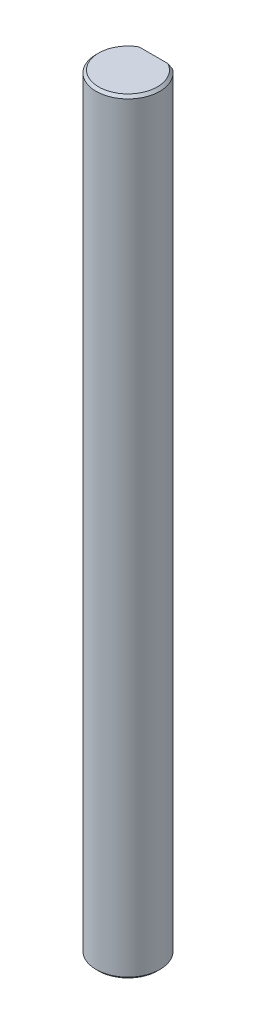
ISO-10303-21;
HEADER;
FILE_DESCRIPTION(('STEP AP214'),'2;1');
FILE_NAME('part.step','',(''),(''),'','','');
FILE_SCHEMA(('AUTOMOTIVE_DESIGN { 1 0 10303 214 1 1 1 1 }'));
ENDSEC;
DATA;
#1=APPLICATION_CONTEXT('core data for automotive mechanical design processes');
#2=APPLICATION_PROTOCOL_DEFINITION('international standard','automotive_design',2000,#1);
#3=PRODUCT_CONTEXT('',#1,'mechanical');
#4=PRODUCT('Part','Part','',(#3));
#5=PRODUCT_RELATED_PRODUCT_CATEGORY('part','',(#4));
#6=PRODUCT_DEFINITION_FORMATION('','',#4);
#7=PRODUCT_DEFINITION_CONTEXT('part definition',#1,'design');
#8=PRODUCT_DEFINITION('design','',#6,#7);
#9=PRODUCT_DEFINITION_SHAPE('','',#8);
#10=(LENGTH_UNIT() NAMED_UNIT(*) SI_UNIT(.MILLI.,.METRE.));
#11=(NAMED_UNIT(*) PLANE_ANGLE_UNIT() SI_UNIT($,.RADIAN.));
#12=(NAMED_UNIT(*) SI_UNIT($,.STERADIAN.) SOLID_ANGLE_UNIT());
#13=UNCERTAINTY_MEASURE_WITH_UNIT(LENGTH_MEASURE(1.E-05),#10,'distance_accuracy_value','');
#14=(GEOMETRIC_REPRESENTATION_CONTEXT(3) GLOBAL_UNCERTAINTY_ASSIGNED_CONTEXT((#13)) GLOBAL_UNIT_ASSIGNED_CONTEXT((#10,
#11,#12)) REPRESENTATION_CONTEXT('',''));
#15=CARTESIAN_POINT('',(0.,0.,0.));
#16=DIRECTION('',(0.,0.,1.));
#17=DIRECTION('',(1.,0.,0.));
#18=AXIS2_PLACEMENT_3D('',#15,#16,#17);
#19=CARTESIAN_POINT('',(0.,60.,0.));
#20=DIRECTION('',(0.,-1.,0.));
#21=DIRECTION('',(0.,0.,-1.));
#22=AXIS2_PLACEMENT_3D('',#19,#20,#21);
#23=CYLINDRICAL_SURFACE('',#22,2.5);
#24=CARTESIAN_POINT('',(0.,0.199999999999985,0.));
#25=DIRECTION('',(0.,1.,0.));
#26=DIRECTION('',(0.,0.,1.));
#27=AXIS2_PLACEMENT_3D('',#24,#25,#26);
#28=CIRCLE('',#27,2.5);
#29=CARTESIAN_POINT('',(0.,0.199999999999985,2.5));
#30=VERTEX_POINT('',#29);
#31=EDGE_CURVE('E101',#30,#30,#28,.T.);
#32=ORIENTED_EDGE('',*,*,#31,.T.);
#33=EDGE_LOOP('',(#32));
#34=FACE_BOUND('',#33,.T.);
#35=DIRECTION('',(0.,1.,0.));
#36=VECTOR('',#35,1.);
#37=CARTESIAN_POINT('',(1.5,50.,-2.));
#38=LINE('',#37,#36);
#39=CARTESIAN_POINT('',(1.5,50.,-2.));
#40=VERTEX_POINT('',#39);
#41=CARTESIAN_POINT('',(1.5,59.8,-2.));
#42=VERTEX_POINT('',#41);
#43=EDGE_CURVE('E93',#40,#42,#38,.T.);
#44=ORIENTED_EDGE('',*,*,#43,.T.);
#45=CARTESIAN_POINT('',(0.,59.8,0.));
#46=DIRECTION('',(0.,1.,0.));
#47=DIRECTION('',(0.,0.,1.));
#48=AXIS2_PLACEMENT_3D('',#45,#46,#47);
#49=CIRCLE('',#48,2.5);
#50=CARTESIAN_POINT('',(-1.5,59.8,-2.));
#51=VERTEX_POINT('',#50);
#52=EDGE_CURVE('E95',#42,#51,#49,.F.);
#53=ORIENTED_EDGE('',*,*,#52,.T.);
#54=DIRECTION('',(0.,1.,0.));
#55=VECTOR('',#54,1.);
#56=CARTESIAN_POINT('',(-1.5,50.,-2.));
#57=LINE('',#56,#55);
#58=CARTESIAN_POINT('',(-1.5,50.,-2.));
#59=VERTEX_POINT('',#58);
#60=EDGE_CURVE('E92',#59,#51,#57,.T.);
#61=ORIENTED_EDGE('',*,*,#60,.F.);
#62=CARTESIAN_POINT('',(0.,50.,0.));
#63=DIRECTION('',(0.,1.,0.));
#64=DIRECTION('',(0.,0.,1.));
#65=AXIS2_PLACEMENT_3D('',#62,#63,#64);
#66=CIRCLE('',#65,2.5);
#67=EDGE_CURVE('E82',#40,#59,#66,.T.);
#68=ORIENTED_EDGE('',*,*,#67,.F.);
#69=EDGE_LOOP('',(#44,#53,#61,#68));
#70=FACE_BOUND('',#69,.T.);
#71=ADVANCED_FACE('F40',(#34,#70),#23,.T.);
#72=CARTESIAN_POINT('',(0.,60.,0.));
#73=DIRECTION('',(0.,1.,0.));
#74=DIRECTION('',(0.,0.,1.));
#75=AXIS2_PLACEMENT_3D('',#72,#73,#74);
#76=PLANE('',#75);
#77=DIRECTION('',(1.,0.,0.));
#78=VECTOR('',#77,1.);
#79=CARTESIAN_POINT('',(-1.5,60.,-2.));
#80=LINE('',#79,#78);
#81=CARTESIAN_POINT('',(-1.13578166916006,60.,-2.));
#82=VERTEX_POINT('',#81);
#83=CARTESIAN_POINT('',(1.13578166916006,60.,-2.));
#84=VERTEX_POINT('',#83);
#85=EDGE_CURVE('E89',#82,#84,#80,.T.);
#86=ORIENTED_EDGE('',*,*,#85,.F.);
#87=CARTESIAN_POINT('',(0.,60.,0.));
#88=DIRECTION('',(0.,1.,0.));
#89=DIRECTION('',(0.,0.,1.));
#90=AXIS2_PLACEMENT_3D('',#87,#88,#89);
#91=CIRCLE('',#90,2.3);
#92=EDGE_CURVE('E107',#82,#84,#91,.T.);
#93=ORIENTED_EDGE('',*,*,#92,.T.);
#94=EDGE_LOOP('',(#86,#93));
#95=FACE_BOUND('',#94,.T.);
#96=ADVANCED_FACE('F117',(#95),#76,.T.);
#97=CARTESIAN_POINT('',(0.,0.,0.));
#98=DIRECTION('',(0.,1.,0.));
#99=DIRECTION('',(0.,0.,1.));
#100=AXIS2_PLACEMENT_3D('',#97,#98,#99);
#101=PLANE('',#100);
#102=CARTESIAN_POINT('',(0.,0.,0.));
#103=DIRECTION('',(0.,1.,0.));
#104=DIRECTION('',(0.,0.,1.));
#105=AXIS2_PLACEMENT_3D('',#102,#103,#104);
#106=CIRCLE('',#105,2.30000000000001);
#107=CARTESIAN_POINT('',(0.,0.,2.30000000000001));
#108=VERTEX_POINT('',#107);
#109=EDGE_CURVE('E104',#108,#108,#106,.F.);
#110=ORIENTED_EDGE('',*,*,#109,.T.);
#111=EDGE_LOOP('',(#110));
#112=FACE_BOUND('',#111,.T.);
#113=ADVANCED_FACE('F116',(#112),#101,.F.);
#114=CARTESIAN_POINT('',(-1.5,50.,-2.));
#115=DIRECTION('',(0.,0.,1.));
#116=DIRECTION('',(1.,0.,0.));
#117=AXIS2_PLACEMENT_3D('',#114,#115,#116);
#118=PLANE('',#117);
#119=ORIENTED_EDGE('',*,*,#85,.T.);
#120=CARTESIAN_POINT('',(1.13578166916006,60.,-2.));
#121=CARTESIAN_POINT('',(1.16684531148887,59.9846588897814,-2.));
#122=CARTESIAN_POINT('',(1.19771947914309,59.9689381376528,-2.));
#123=CARTESIAN_POINT('',(1.25909582358932,59.9368162971824,-2.));
#124=CARTESIAN_POINT('',(1.28959814953929,59.920415494086,-2.));
#125=CARTESIAN_POINT('',(1.35026188212942,59.8870005487157,-2.));
#126=CARTESIAN_POINT('',(1.38042330727701,59.8699864399502,-2.));
#127=CARTESIAN_POINT('',(1.44043971345171,59.8353973160196,-2.));
#128=CARTESIAN_POINT('',(1.47029456200406,59.8178220708339,-2.));
#129=CARTESIAN_POINT('',(1.5,59.8,-2.));
#130=B_SPLINE_CURVE_WITH_KNOTS('',3,(#120,#121,#122,#123,#124,#125,#126,#127,#128,#129),
.UNSPECIFIED.,.F.,.F.,(4,2,2,2,4),(0.,0.103930863284107,0.207818565532301,0.311700600383635,
0.415625779466394),.UNSPECIFIED.);
#131=EDGE_CURVE('E11',#84,#42,#130,.T.);
#132=ORIENTED_EDGE('',*,*,#131,.T.);
#133=ORIENTED_EDGE('',*,*,#43,.F.);
#134=DIRECTION('',(1.,0.,0.));
#135=VECTOR('',#134,1.);
#136=CARTESIAN_POINT('',(-1.5,50.,-2.));
#137=LINE('',#136,#135);
#138=EDGE_CURVE('E85',#59,#40,#137,.T.);
#139=ORIENTED_EDGE('',*,*,#138,.F.);
#140=ORIENTED_EDGE('',*,*,#60,.T.);
#141=CARTESIAN_POINT('',(-1.5,59.8,-2.));
#142=CARTESIAN_POINT('',(-1.47029456200406,59.8178220708339,-2.));
#143=CARTESIAN_POINT('',(-1.44043971345171,59.8353973160196,-2.));
#144=CARTESIAN_POINT('',(-1.38042330727701,59.8699864399502,-2.));
#145=CARTESIAN_POINT('',(-1.35026188212942,59.8870005487157,-2.));
#146=CARTESIAN_POINT('',(-1.28959814953929,59.920415494086,-2.));
#147=CARTESIAN_POINT('',(-1.25909582358931,59.9368162971824,-2.));
#148=CARTESIAN_POINT('',(-1.19771947914309,59.9689381376528,-2.));
#149=CARTESIAN_POINT('',(-1.16684531148886,59.9846588897814,-2.));
#150=CARTESIAN_POINT('',(-1.13578166916006,60.,-2.));
#151=B_SPLINE_CURVE_WITH_KNOTS('',3,(#141,#142,#143,#144,#145,#146,#147,#148,#149,#150),
.UNSPECIFIED.,.F.,.F.,(4,2,2,2,4),(0.,0.10392517908276,0.207807213934094,0.311694916182291,
0.415625779466395),.UNSPECIFIED.);
#152=EDGE_CURVE('E55',#51,#82,#151,.T.);
#153=ORIENTED_EDGE('',*,*,#152,.T.);
#154=EDGE_LOOP('',(#119,#132,#133,#139,#140,#153));
#155=FACE_BOUND('',#154,.T.);
#156=ADVANCED_FACE('F91',(#155),#118,.F.);
#157=CARTESIAN_POINT('',(0.,50.,0.));
#158=DIRECTION('',(0.,1.,0.));
#159=DIRECTION('',(0.,0.,1.));
#160=AXIS2_PLACEMENT_3D('',#157,#158,#159);
#161=PLANE('',#160);
#162=ORIENTED_EDGE('',*,*,#67,.T.);
#163=ORIENTED_EDGE('',*,*,#138,.T.);
#164=EDGE_LOOP('',(#162,#163));
#165=FACE_BOUND('',#164,.T.);
#166=ADVANCED_FACE('F84',(#165),#161,.T.);
#167=CARTESIAN_POINT('',(0.,0.199999999999985,0.));
#168=DIRECTION('',(0.,1.,0.));
#169=DIRECTION('',(0.,0.,1.));
#170=AXIS2_PLACEMENT_3D('',#167,#168,#169);
#171=CONICAL_SURFACE('',#170,2.5,0.78539816339746);
#172=ORIENTED_EDGE('',*,*,#109,.F.);
#173=EDGE_LOOP('',(#172));
#174=FACE_BOUND('',#173,.T.);
#175=ORIENTED_EDGE('',*,*,#31,.F.);
#176=EDGE_LOOP('',(#175));
#177=FACE_BOUND('',#176,.T.);
#178=ADVANCED_FACE('F128',(#174,#177),#171,.T.);
#179=CARTESIAN_POINT('',(0.,60.,0.));
#180=DIRECTION('',(0.,-1.,0.));
#181=DIRECTION('',(0.,0.,-1.));
#182=AXIS2_PLACEMENT_3D('',#179,#180,#181);
#183=CONICAL_SURFACE('',#182,2.3,0.785398163397443);
#184=ORIENTED_EDGE('',*,*,#152,.F.);
#185=ORIENTED_EDGE('',*,*,#52,.F.);
#186=ORIENTED_EDGE('',*,*,#131,.F.);
#187=ORIENTED_EDGE('',*,*,#92,.F.);
#188=EDGE_LOOP('',(#184,#185,#186,#187));
#189=FACE_BOUND('',#188,.T.);
#190=ADVANCED_FACE('F43',(#189),#183,.T.);
#191=CLOSED_SHELL('',(#71,#96,#113,#156,#166,#178,#190));
#192=MANIFOLD_SOLID_BREP('B2',#191);
#193=ADVANCED_BREP_SHAPE_REPRESENTATION('',(#18,#192),#14);
#194=SHAPE_DEFINITION_REPRESENTATION(#9,#193);
ENDSEC;
END-ISO-10303-21;
